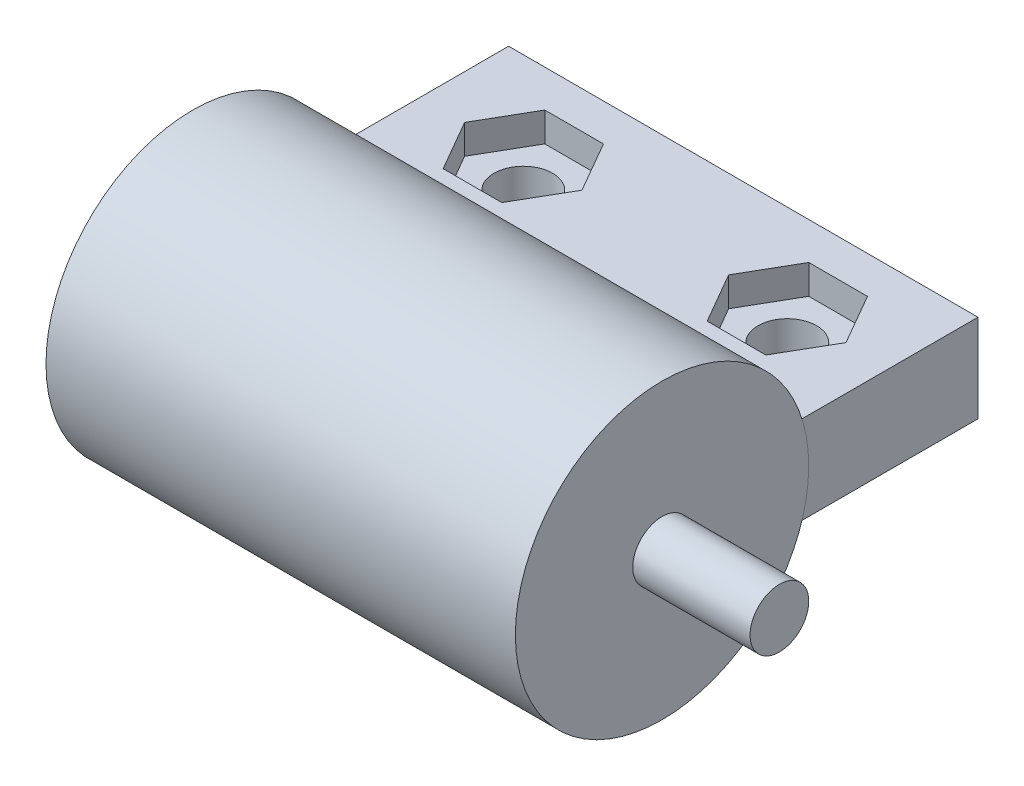
ISO-10303-21;
HEADER;
FILE_DESCRIPTION(('STEP AP214'),'2;1');
FILE_NAME('part.step','',(''),(''),'','','');
FILE_SCHEMA(('AUTOMOTIVE_DESIGN { 1 0 10303 214 1 1 1 1 }'));
ENDSEC;
DATA;
#1=APPLICATION_CONTEXT('core data for automotive mechanical design processes');
#2=APPLICATION_PROTOCOL_DEFINITION('international standard','automotive_design',2000,#1);
#3=PRODUCT_CONTEXT('',#1,'mechanical');
#4=PRODUCT('Part','Part','',(#3));
#5=PRODUCT_RELATED_PRODUCT_CATEGORY('part','',(#4));
#6=PRODUCT_DEFINITION_FORMATION('','',#4);
#7=PRODUCT_DEFINITION_CONTEXT('part definition',#1,'design');
#8=PRODUCT_DEFINITION('design','',#6,#7);
#9=PRODUCT_DEFINITION_SHAPE('','',#8);
#10=(LENGTH_UNIT() NAMED_UNIT(*) SI_UNIT(.MILLI.,.METRE.));
#11=(NAMED_UNIT(*) PLANE_ANGLE_UNIT() SI_UNIT($,.RADIAN.));
#12=(NAMED_UNIT(*) SI_UNIT($,.STERADIAN.) SOLID_ANGLE_UNIT());
#13=UNCERTAINTY_MEASURE_WITH_UNIT(LENGTH_MEASURE(1.E-05),#10,'distance_accuracy_value','');
#14=(GEOMETRIC_REPRESENTATION_CONTEXT(3) GLOBAL_UNCERTAINTY_ASSIGNED_CONTEXT((#13)) GLOBAL_UNIT_ASSIGNED_CONTEXT((#10,
#11,#12)) REPRESENTATION_CONTEXT('',''));
#15=CARTESIAN_POINT('',(0.,0.,0.));
#16=DIRECTION('',(0.,0.,1.));
#17=DIRECTION('',(1.,0.,0.));
#18=AXIS2_PLACEMENT_3D('',#15,#16,#17);
#19=CARTESIAN_POINT('',(-7.07106781186547,0.749999999999999,2.38484800354237));
#20=DIRECTION('',(1.,0.,0.));
#21=DIRECTION('',(0.,0.,-1.));
#22=AXIS2_PLACEMENT_3D('',#19,#20,#21);
#23=CYLINDRICAL_SURFACE('',#22,2.5);
#24=CARTESIAN_POINT('',(0.,0.749999999999999,2.38484800354237));
#25=DIRECTION('',(1.,0.,0.));
#26=DIRECTION('',(0.,0.,-1.));
#27=AXIS2_PLACEMENT_3D('',#24,#25,#26);
#28=CIRCLE('',#27,2.5);
#29=CARTESIAN_POINT('',(0.,0.749999999999999,-0.115151996457631));
#30=VERTEX_POINT('',#29);
#31=EDGE_CURVE('E58',#30,#30,#28,.F.);
#32=ORIENTED_EDGE('',*,*,#31,.F.);
#33=EDGE_LOOP('',(#32));
#34=FACE_BOUND('',#33,.T.);
#35=CARTESIAN_POINT('',(8.,0.749999999999999,2.38484800354237));
#36=DIRECTION('',(1.,0.,0.));
#37=DIRECTION('',(0.,0.,-1.));
#38=AXIS2_PLACEMENT_3D('',#35,#36,#37);
#39=CIRCLE('',#38,2.5);
#40=CARTESIAN_POINT('',(8.,0.749999999999999,-0.115151996457631));
#41=VERTEX_POINT('',#40);
#42=EDGE_CURVE('E68',#41,#41,#39,.T.);
#43=ORIENTED_EDGE('',*,*,#42,.F.);
#44=EDGE_LOOP('',(#43));
#45=FACE_BOUND('',#44,.T.);
#46=ADVANCED_FACE('F55',(#34,#45),#23,.T.);
#47=CARTESIAN_POINT('',(8.,0.749999999999999,2.38484800354237));
#48=DIRECTION('',(1.,0.,0.));
#49=DIRECTION('',(0.,0.,-1.));
#50=AXIS2_PLACEMENT_3D('',#47,#48,#49);
#51=PLANE('',#50);
#52=CARTESIAN_POINT('',(8.,0.749999999999999,2.38484800354236));
#53=DIRECTION('',(1.,0.,0.));
#54=DIRECTION('',(0.,0.,-1.));
#55=AXIS2_PLACEMENT_3D('',#52,#53,#54);
#56=CIRCLE('',#55,0.5);
#57=CARTESIAN_POINT('',(8.,0.749999999999999,1.88484800354236));
#58=VERTEX_POINT('',#57);
#59=EDGE_CURVE('E11',#58,#58,#56,.T.);
#60=ORIENTED_EDGE('',*,*,#59,.F.);
#61=EDGE_LOOP('',(#60));
#62=FACE_BOUND('',#61,.T.);
#63=ORIENTED_EDGE('',*,*,#42,.T.);
#64=EDGE_LOOP('',(#63));
#65=FACE_BOUND('',#64,.T.);
#66=ADVANCED_FACE('F91',(#62,#65),#51,.T.);
#67=CARTESIAN_POINT('',(0.,1.,0.));
#68=DIRECTION('',(1.,0.,0.));
#69=DIRECTION('',(0.,0.,-1.));
#70=AXIS2_PLACEMENT_3D('',#67,#68,#69);
#71=PLANE('',#70);
#72=ORIENTED_EDGE('',*,*,#31,.T.);
#73=EDGE_LOOP('',(#72));
#74=FACE_BOUND('',#73,.T.);
#75=ADVANCED_FACE('F83',(#74),#71,.F.);
#76=CARTESIAN_POINT('',(10.,0.749999999999999,2.38484800354236));
#77=DIRECTION('',(-1.,0.,0.));
#78=DIRECTION('',(0.,0.,1.));
#79=AXIS2_PLACEMENT_3D('',#76,#77,#78);
#80=CYLINDRICAL_SURFACE('',#79,0.5);
#81=CARTESIAN_POINT('',(10.,0.749999999999999,2.38484800354236));
#82=DIRECTION('',(1.,0.,0.));
#83=DIRECTION('',(0.,0.,-1.));
#84=AXIS2_PLACEMENT_3D('',#81,#82,#83);
#85=CIRCLE('',#84,0.5);
#86=CARTESIAN_POINT('',(10.,0.749999999999999,1.88484800354236));
#87=VERTEX_POINT('',#86);
#88=EDGE_CURVE('E70',#87,#87,#85,.T.);
#89=ORIENTED_EDGE('',*,*,#88,.F.);
#90=EDGE_LOOP('',(#89));
#91=FACE_BOUND('',#90,.T.);
#92=ORIENTED_EDGE('',*,*,#59,.T.);
#93=EDGE_LOOP('',(#92));
#94=FACE_BOUND('',#93,.T.);
#95=ADVANCED_FACE('F81',(#91,#94),#80,.T.);
#96=CARTESIAN_POINT('',(10.,0.749999999999999,2.38484800354236));
#97=DIRECTION('',(1.,0.,0.));
#98=DIRECTION('',(0.,0.,-1.));
#99=AXIS2_PLACEMENT_3D('',#96,#97,#98);
#100=PLANE('',#99);
#101=ORIENTED_EDGE('',*,*,#88,.T.);
#102=EDGE_LOOP('',(#101));
#103=FACE_BOUND('',#102,.T.);
#104=ADVANCED_FACE('F79',(#103),#100,.T.);
#105=CLOSED_SHELL('',(#46,#66,#75,#95,#104));
#106=MANIFOLD_SOLID_BREP('B2',#105);
#107=CARTESIAN_POINT('',(0.,1.,0.));
#108=DIRECTION('',(0.,-1.,0.));
#109=DIRECTION('',(0.,0.,-1.));
#110=AXIS2_PLACEMENT_3D('',#107,#108,#109);
#111=PLANE('',#110);
#112=CARTESIAN_POINT('',(1.75,1.,-1.5));
#113=DIRECTION('',(0.,1.,0.));
#114=DIRECTION('',(0.,0.,1.));
#115=AXIS2_PLACEMENT_3D('',#112,#113,#114);
#116=CIRCLE('',#115,0.5);
#117=CARTESIAN_POINT('',(1.75,1.,-1.));
#118=VERTEX_POINT('',#117);
#119=EDGE_CURVE('E283',#118,#118,#116,.T.);
#120=ORIENTED_EDGE('',*,*,#119,.F.);
#121=EDGE_LOOP('',(#120));
#122=FACE_BOUND('',#121,.T.);
#123=DIRECTION('',(-1.,0.,0.));
#124=VECTOR('',#123,1.);
#125=CARTESIAN_POINT('',(0.,1.,-0.63397459621556));
#126=LINE('',#125,#124);
#127=CARTESIAN_POINT('',(2.25,1.,-0.63397459621556));
#128=VERTEX_POINT('',#127);
#129=CARTESIAN_POINT('',(1.25,1.,-0.63397459621556));
#130=VERTEX_POINT('',#129);
#131=EDGE_CURVE('E145',#128,#130,#126,.T.);
#132=ORIENTED_EDGE('',*,*,#131,.F.);
#133=DIRECTION('',(0.499999999999998,0.,-0.86602540378444));
#134=VECTOR('',#133,1.);
#135=CARTESIAN_POINT('',(1.41298094716168,1.,0.815784930203602));
#136=LINE('',#135,#134);
#137=CARTESIAN_POINT('',(2.75,1.,-1.5));
#138=VERTEX_POINT('',#137);
#139=EDGE_CURVE('E150',#128,#138,#136,.T.);
#140=ORIENTED_EDGE('',*,*,#139,.T.);
#141=DIRECTION('',(0.499999999999998,0.,0.86602540378444));
#142=VECTOR('',#141,1.);
#143=CARTESIAN_POINT('',(2.71201905283833,1.,-1.5657849302036));
#144=LINE('',#143,#142);
#145=CARTESIAN_POINT('',(2.25,1.,-2.36602540378444));
#146=VERTEX_POINT('',#145);
#147=EDGE_CURVE('E360',#146,#138,#144,.T.);
#148=ORIENTED_EDGE('',*,*,#147,.F.);
#149=DIRECTION('',(-1.,0.,0.));
#150=VECTOR('',#149,1.);
#151=CARTESIAN_POINT('',(0.,1.,-2.36602540378444));
#152=LINE('',#151,#150);
#153=CARTESIAN_POINT('',(1.25,1.,-2.36602540378444));
#154=VERTEX_POINT('',#153);
#155=EDGE_CURVE('E358',#146,#154,#152,.T.);
#156=ORIENTED_EDGE('',*,*,#155,.T.);
#157=DIRECTION('',(-0.499999999999998,0.,0.86602540378444));
#158=VECTOR('',#157,1.);
#159=CARTESIAN_POINT('',(-0.0870190528383232,1.,-0.0502404735808319));
#160=LINE('',#159,#158);
#161=CARTESIAN_POINT('',(0.750000000000002,1.,-1.5));
#162=VERTEX_POINT('',#161);
#163=EDGE_CURVE('E356',#154,#162,#160,.T.);
#164=ORIENTED_EDGE('',*,*,#163,.T.);
#165=DIRECTION('',(-0.499999999999998,0.,-0.86602540378444));
#166=VECTOR('',#165,1.);
#167=CARTESIAN_POINT('',(1.21201905283833,1.,-0.699759526419161));
#168=LINE('',#167,#166);
#169=EDGE_CURVE('E354',#130,#162,#168,.T.);
#170=ORIENTED_EDGE('',*,*,#169,.F.);
#171=EDGE_LOOP('',(#132,#140,#148,#156,#164,#170));
#172=FACE_BOUND('',#171,.T.);
#173=ADVANCED_FACE('F130',(#122,#172),#111,.F.);
#174=DIRECTION('',(1.,0.,0.));
#175=VECTOR('',#174,1.);
#176=CARTESIAN_POINT('',(0.,1.,-2.36602540378444));
#177=LINE('',#176,#175);
#178=CARTESIAN_POINT('',(5.75,1.,-2.36602540378444));
#179=VERTEX_POINT('',#178);
#180=CARTESIAN_POINT('',(6.75,1.,-2.36602540378444));
#181=VERTEX_POINT('',#180);
#182=EDGE_CURVE('E366',#179,#181,#177,.T.);
#183=ORIENTED_EDGE('',*,*,#182,.F.);
#184=DIRECTION('',(-0.499999999999997,0.,0.86602540378444));
#185=VECTOR('',#184,1.);
#186=CARTESIAN_POINT('',(3.28798094716169,1.,1.89831668493415));
#187=LINE('',#186,#185);
#188=CARTESIAN_POINT('',(5.25,1.,-1.5));
#189=VERTEX_POINT('',#188);
#190=EDGE_CURVE('E364',#179,#189,#187,.T.);
#191=ORIENTED_EDGE('',*,*,#190,.T.);
#192=DIRECTION('',(-0.499999999999997,0.,-0.86602540378444));
#193=VECTOR('',#192,1.);
#194=CARTESIAN_POINT('',(4.58701905283834,1.,-2.64831668493414));
#195=LINE('',#194,#193);
#196=CARTESIAN_POINT('',(5.75,1.,-0.633974596215561));
#197=VERTEX_POINT('',#196);
#198=EDGE_CURVE('E263',#197,#189,#195,.T.);
#199=ORIENTED_EDGE('',*,*,#198,.F.);
#200=DIRECTION('',(1.,0.,0.));
#201=VECTOR('',#200,1.);
#202=CARTESIAN_POINT('',(0.,1.,-0.63397459621556));
#203=LINE('',#202,#201);
#204=CARTESIAN_POINT('',(6.75,1.,-0.633974596215561));
#205=VERTEX_POINT('',#204);
#206=EDGE_CURVE('E374',#197,#205,#203,.T.);
#207=ORIENTED_EDGE('',*,*,#206,.T.);
#208=DIRECTION('',(0.499999999999997,0.,-0.86602540378444));
#209=VECTOR('',#208,1.);
#210=CARTESIAN_POINT('',(4.78798094716169,1.,2.76434208871858));
#211=LINE('',#210,#209);
#212=CARTESIAN_POINT('',(7.25,1.,-1.5));
#213=VERTEX_POINT('',#212);
#214=EDGE_CURVE('E372',#205,#213,#211,.T.);
#215=ORIENTED_EDGE('',*,*,#214,.T.);
#216=DIRECTION('',(0.499999999999998,0.,0.86602540378444));
#217=VECTOR('',#216,1.);
#218=CARTESIAN_POINT('',(6.08701905283834,1.,-3.51434208871858));
#219=LINE('',#218,#217);
#220=EDGE_CURVE('E369',#181,#213,#219,.T.);
#221=ORIENTED_EDGE('',*,*,#220,.F.);
#222=EDGE_LOOP('',(#183,#191,#199,#207,#215,#221));
#223=FACE_BOUND('',#222,.T.);
#224=CARTESIAN_POINT('',(6.25,1.,-1.5));
#225=DIRECTION('',(0.,1.,0.));
#226=DIRECTION('',(0.,0.,1.));
#227=AXIS2_PLACEMENT_3D('',#224,#225,#226);
#228=CIRCLE('',#227,0.500000000000001);
#229=CARTESIAN_POINT('',(6.25,1.,-0.999999999999999));
#230=VERTEX_POINT('',#229);
#231=EDGE_CURVE('E275',#230,#230,#228,.T.);
#232=ORIENTED_EDGE('',*,*,#231,.F.);
#233=EDGE_LOOP('',(#232));
#234=FACE_BOUND('',#233,.T.);
#235=ADVANCED_FACE('F426',(#223,#234),#111,.F.);
#236=CARTESIAN_POINT('',(0.,0.,0.));
#237=DIRECTION('',(0.,-1.,0.));
#238=DIRECTION('',(0.,0.,-1.));
#239=AXIS2_PLACEMENT_3D('',#236,#237,#238);
#240=PLANE('',#239);
#241=CARTESIAN_POINT('',(1.75,0.,-1.5));
#242=DIRECTION('',(0.,1.,0.));
#243=DIRECTION('',(0.,0.,1.));
#244=AXIS2_PLACEMENT_3D('',#241,#242,#243);
#245=CIRCLE('',#244,0.5);
#246=CARTESIAN_POINT('',(1.75,0.,-1.));
#247=VERTEX_POINT('',#246);
#248=EDGE_CURVE('E278',#247,#247,#245,.T.);
#249=ORIENTED_EDGE('',*,*,#248,.T.);
#250=EDGE_LOOP('',(#249));
#251=FACE_BOUND('',#250,.T.);
#252=DIRECTION('',(0.,0.,1.));
#253=VECTOR('',#252,1.);
#254=CARTESIAN_POINT('',(0.,0.,0.));
#255=LINE('',#254,#253);
#256=CARTESIAN_POINT('',(0.,0.,-3.));
#257=VERTEX_POINT('',#256);
#258=CARTESIAN_POINT('',(0.,0.,0.));
#259=VERTEX_POINT('',#258);
#260=EDGE_CURVE('E286',#257,#259,#255,.T.);
#261=ORIENTED_EDGE('',*,*,#260,.F.);
#262=DIRECTION('',(-1.,0.,0.));
#263=VECTOR('',#262,1.);
#264=CARTESIAN_POINT('',(0.,0.,-3.));
#265=LINE('',#264,#263);
#266=CARTESIAN_POINT('',(8.,0.,-3.));
#267=VERTEX_POINT('',#266);
#268=EDGE_CURVE('E295',#267,#257,#265,.T.);
#269=ORIENTED_EDGE('',*,*,#268,.F.);
#270=DIRECTION('',(0.,0.,-1.));
#271=VECTOR('',#270,1.);
#272=CARTESIAN_POINT('',(8.,0.,0.));
#273=LINE('',#272,#271);
#274=CARTESIAN_POINT('',(8.,0.,0.));
#275=VERTEX_POINT('',#274);
#276=EDGE_CURVE('E293',#275,#267,#273,.T.);
#277=ORIENTED_EDGE('',*,*,#276,.F.);
#278=DIRECTION('',(1.,0.,0.));
#279=VECTOR('',#278,1.);
#280=CARTESIAN_POINT('',(0.,0.,0.));
#281=LINE('',#280,#279);
#282=EDGE_CURVE('E291',#259,#275,#281,.T.);
#283=ORIENTED_EDGE('',*,*,#282,.F.);
#284=EDGE_LOOP('',(#261,#269,#277,#283));
#285=FACE_BOUND('',#284,.T.);
#286=CARTESIAN_POINT('',(6.25,0.,-1.5));
#287=DIRECTION('',(0.,1.,0.));
#288=DIRECTION('',(0.,0.,1.));
#289=AXIS2_PLACEMENT_3D('',#286,#287,#288);
#290=CIRCLE('',#289,0.500000000000001);
#291=CARTESIAN_POINT('',(6.25,0.,-0.999999999999999));
#292=VERTEX_POINT('',#291);
#293=EDGE_CURVE('E279',#292,#292,#290,.T.);
#294=ORIENTED_EDGE('',*,*,#293,.T.);
#295=EDGE_LOOP('',(#294));
#296=FACE_BOUND('',#295,.T.);
#297=ADVANCED_FACE('F315',(#251,#285,#296),#240,.T.);
#298=CARTESIAN_POINT('',(0.,1.,0.));
#299=DIRECTION('',(1.,0.,0.));
#300=DIRECTION('',(0.,0.,-1.));
#301=AXIS2_PLACEMENT_3D('',#298,#299,#300);
#302=PLANE('',#301);
#303=ORIENTED_EDGE('',*,*,#260,.T.);
#304=DIRECTION('',(0.,-1.,0.));
#305=VECTOR('',#304,1.);
#306=CARTESIAN_POINT('',(0.,1.,0.));
#307=LINE('',#306,#305);
#308=CARTESIAN_POINT('',(0.,1.5,0.));
#309=VERTEX_POINT('',#308);
#310=EDGE_CURVE('E53',#309,#259,#307,.T.);
#311=ORIENTED_EDGE('',*,*,#310,.F.);
#312=DIRECTION('',(0.,0.,1.));
#313=VECTOR('',#312,1.);
#314=CARTESIAN_POINT('',(0.,1.5,0.));
#315=LINE('',#314,#313);
#316=CARTESIAN_POINT('',(0.,1.5,-3.));
#317=VERTEX_POINT('',#316);
#318=EDGE_CURVE('E323',#317,#309,#315,.T.);
#319=ORIENTED_EDGE('',*,*,#318,.F.);
#320=DIRECTION('',(0.,-1.,0.));
#321=VECTOR('',#320,1.);
#322=CARTESIAN_POINT('',(0.,1.,-3.));
#323=LINE('',#322,#321);
#324=EDGE_CURVE('E297',#317,#257,#323,.T.);
#325=ORIENTED_EDGE('',*,*,#324,.T.);
#326=EDGE_LOOP('',(#303,#311,#319,#325));
#327=FACE_BOUND('',#326,.T.);
#328=ADVANCED_FACE('F132',(#327),#302,.F.);
#329=CARTESIAN_POINT('',(0.,1.,0.));
#330=DIRECTION('',(0.,0.,-1.));
#331=DIRECTION('',(-1.,0.,0.));
#332=AXIS2_PLACEMENT_3D('',#329,#330,#331);
#333=PLANE('',#332);
#334=ORIENTED_EDGE('',*,*,#282,.T.);
#335=DIRECTION('',(0.,-1.,0.));
#336=VECTOR('',#335,1.);
#337=CARTESIAN_POINT('',(8.,1.,0.));
#338=LINE('',#337,#336);
#339=CARTESIAN_POINT('',(8.,1.5,0.));
#340=VERTEX_POINT('',#339);
#341=EDGE_CURVE('E138',#340,#275,#338,.T.);
#342=ORIENTED_EDGE('',*,*,#341,.F.);
#343=DIRECTION('',(1.,0.,0.));
#344=VECTOR('',#343,1.);
#345=CARTESIAN_POINT('',(0.,1.5,0.));
#346=LINE('',#345,#344);
#347=EDGE_CURVE('E325',#309,#340,#346,.T.);
#348=ORIENTED_EDGE('',*,*,#347,.F.);
#349=ORIENTED_EDGE('',*,*,#310,.T.);
#350=EDGE_LOOP('',(#334,#342,#348,#349));
#351=FACE_BOUND('',#350,.T.);
#352=ADVANCED_FACE('F445',(#351),#333,.F.);
#353=CARTESIAN_POINT('',(8.,1.,0.));
#354=DIRECTION('',(-1.,0.,0.));
#355=DIRECTION('',(0.,0.,1.));
#356=AXIS2_PLACEMENT_3D('',#353,#354,#355);
#357=PLANE('',#356);
#358=ORIENTED_EDGE('',*,*,#276,.T.);
#359=DIRECTION('',(0.,-1.,0.));
#360=VECTOR('',#359,1.);
#361=CARTESIAN_POINT('',(8.,1.,-3.));
#362=LINE('',#361,#360);
#363=CARTESIAN_POINT('',(8.,1.5,-3.));
#364=VERTEX_POINT('',#363);
#365=EDGE_CURVE('E300',#364,#267,#362,.T.);
#366=ORIENTED_EDGE('',*,*,#365,.F.);
#367=DIRECTION('',(0.,0.,-1.));
#368=VECTOR('',#367,1.);
#369=CARTESIAN_POINT('',(8.,1.5,0.));
#370=LINE('',#369,#368);
#371=EDGE_CURVE('E308',#340,#364,#370,.T.);
#372=ORIENTED_EDGE('',*,*,#371,.F.);
#373=ORIENTED_EDGE('',*,*,#341,.T.);
#374=EDGE_LOOP('',(#358,#366,#372,#373));
#375=FACE_BOUND('',#374,.T.);
#376=ADVANCED_FACE('F306',(#375),#357,.F.);
#377=CARTESIAN_POINT('',(0.,1.,-3.));
#378=DIRECTION('',(0.,0.,1.));
#379=DIRECTION('',(1.,0.,0.));
#380=AXIS2_PLACEMENT_3D('',#377,#378,#379);
#381=PLANE('',#380);
#382=ORIENTED_EDGE('',*,*,#268,.T.);
#383=ORIENTED_EDGE('',*,*,#324,.F.);
#384=DIRECTION('',(-1.,0.,0.));
#385=VECTOR('',#384,1.);
#386=CARTESIAN_POINT('',(0.,1.5,-3.));
#387=LINE('',#386,#385);
#388=EDGE_CURVE('E326',#364,#317,#387,.T.);
#389=ORIENTED_EDGE('',*,*,#388,.F.);
#390=ORIENTED_EDGE('',*,*,#365,.T.);
#391=EDGE_LOOP('',(#382,#383,#389,#390));
#392=FACE_BOUND('',#391,.T.);
#393=ADVANCED_FACE('F318',(#392),#381,.F.);
#394=CARTESIAN_POINT('',(1.75,1.,-1.5));
#395=DIRECTION('',(0.,-1.,0.));
#396=DIRECTION('',(0.,0.,-1.));
#397=AXIS2_PLACEMENT_3D('',#394,#395,#396);
#398=CYLINDRICAL_SURFACE('',#397,0.5);
#399=ORIENTED_EDGE('',*,*,#119,.T.);
#400=EDGE_LOOP('',(#399));
#401=FACE_BOUND('',#400,.T.);
#402=ORIENTED_EDGE('',*,*,#248,.F.);
#403=EDGE_LOOP('',(#402));
#404=FACE_BOUND('',#403,.T.);
#405=ADVANCED_FACE('F437',(#401,#404),#398,.F.);
#406=CARTESIAN_POINT('',(6.25,1.,-1.5));
#407=DIRECTION('',(0.,-1.,0.));
#408=DIRECTION('',(0.,0.,-1.));
#409=AXIS2_PLACEMENT_3D('',#406,#407,#408);
#410=CYLINDRICAL_SURFACE('',#409,0.500000000000001);
#411=ORIENTED_EDGE('',*,*,#231,.T.);
#412=EDGE_LOOP('',(#411));
#413=FACE_BOUND('',#412,.T.);
#414=ORIENTED_EDGE('',*,*,#293,.F.);
#415=EDGE_LOOP('',(#414));
#416=FACE_BOUND('',#415,.T.);
#417=ADVANCED_FACE('F501',(#413,#416),#410,.F.);
#418=CARTESIAN_POINT('',(3.28798094716169,1.5,1.89831668493415));
#419=DIRECTION('',(0.86602540378444,0.,0.499999999999997));
#420=DIRECTION('',(0.499999999999997,0.,-0.86602540378444));
#421=AXIS2_PLACEMENT_3D('',#418,#419,#420);
#422=PLANE('',#421);
#423=ORIENTED_EDGE('',*,*,#190,.F.);
#424=DIRECTION('',(0.,-1.,0.));
#425=VECTOR('',#424,1.);
#426=CARTESIAN_POINT('',(5.75,1.5,-2.36602540378444));
#427=LINE('',#426,#425);
#428=CARTESIAN_POINT('',(5.75,1.5,-2.36602540378444));
#429=VERTEX_POINT('',#428);
#430=EDGE_CURVE('E282',#429,#179,#427,.T.);
#431=ORIENTED_EDGE('',*,*,#430,.F.);
#432=DIRECTION('',(-0.499999999999997,0.,0.86602540378444));
#433=VECTOR('',#432,1.);
#434=CARTESIAN_POINT('',(3.28798094716169,1.5,1.89831668493415));
#435=LINE('',#434,#433);
#436=CARTESIAN_POINT('',(5.25,1.5,-1.5));
#437=VERTEX_POINT('',#436);
#438=EDGE_CURVE('E336',#429,#437,#435,.T.);
#439=ORIENTED_EDGE('',*,*,#438,.T.);
#440=DIRECTION('',(0.,-1.,0.));
#441=VECTOR('',#440,1.);
#442=CARTESIAN_POINT('',(5.25,1.5,-1.5));
#443=LINE('',#442,#441);
#444=EDGE_CURVE('E266',#437,#189,#443,.T.);
#445=ORIENTED_EDGE('',*,*,#444,.T.);
#446=EDGE_LOOP('',(#423,#431,#439,#445));
#447=FACE_BOUND('',#446,.T.);
#448=ADVANCED_FACE('F508',(#447),#422,.T.);
#449=CARTESIAN_POINT('',(0.,1.5,-2.36602540378444));
#450=DIRECTION('',(0.,0.,-1.));
#451=DIRECTION('',(-1.,0.,0.));
#452=AXIS2_PLACEMENT_3D('',#449,#450,#451);
#453=PLANE('',#452);
#454=ORIENTED_EDGE('',*,*,#182,.T.);
#455=DIRECTION('',(0.,-1.,0.));
#456=VECTOR('',#455,1.);
#457=CARTESIAN_POINT('',(6.75,1.5,-2.36602540378444));
#458=LINE('',#457,#456);
#459=CARTESIAN_POINT('',(6.75,1.5,-2.36602540378444));
#460=VERTEX_POINT('',#459);
#461=EDGE_CURVE('E386',#460,#181,#458,.T.);
#462=ORIENTED_EDGE('',*,*,#461,.F.);
#463=DIRECTION('',(1.,0.,0.));
#464=VECTOR('',#463,1.);
#465=CARTESIAN_POINT('',(0.,1.5,-2.36602540378444));
#466=LINE('',#465,#464);
#467=EDGE_CURVE('E339',#429,#460,#466,.T.);
#468=ORIENTED_EDGE('',*,*,#467,.F.);
#469=ORIENTED_EDGE('',*,*,#430,.T.);
#470=EDGE_LOOP('',(#454,#462,#468,#469));
#471=FACE_BOUND('',#470,.T.);
#472=ADVANCED_FACE('F521',(#471),#453,.F.);
#473=CARTESIAN_POINT('',(6.08701905283834,1.5,-3.51434208871858));
#474=DIRECTION('',(0.86602540378444,0.,-0.499999999999998));
#475=DIRECTION('',(-0.499999999999998,0.,-0.86602540378444));
#476=AXIS2_PLACEMENT_3D('',#473,#474,#475);
#477=PLANE('',#476);
#478=ORIENTED_EDGE('',*,*,#220,.T.);
#479=DIRECTION('',(0.,-1.,0.));
#480=VECTOR('',#479,1.);
#481=CARTESIAN_POINT('',(7.25,1.5,-1.5));
#482=LINE('',#481,#480);
#483=CARTESIAN_POINT('',(7.25,1.5,-1.5));
#484=VERTEX_POINT('',#483);
#485=EDGE_CURVE('E383',#484,#213,#482,.T.);
#486=ORIENTED_EDGE('',*,*,#485,.F.);
#487=DIRECTION('',(0.499999999999998,0.,0.86602540378444));
#488=VECTOR('',#487,1.);
#489=CARTESIAN_POINT('',(6.08701905283834,1.5,-3.51434208871858));
#490=LINE('',#489,#488);
#491=EDGE_CURVE('E342',#460,#484,#490,.T.);
#492=ORIENTED_EDGE('',*,*,#491,.F.);
#493=ORIENTED_EDGE('',*,*,#461,.T.);
#494=EDGE_LOOP('',(#478,#486,#492,#493));
#495=FACE_BOUND('',#494,.T.);
#496=ADVANCED_FACE('F529',(#495),#477,.F.);
#497=CARTESIAN_POINT('',(4.78798094716169,1.5,2.76434208871858));
#498=DIRECTION('',(-0.86602540378444,0.,-0.499999999999997));
#499=DIRECTION('',(-0.499999999999997,0.,0.86602540378444));
#500=AXIS2_PLACEMENT_3D('',#497,#498,#499);
#501=PLANE('',#500);
#502=ORIENTED_EDGE('',*,*,#214,.F.);
#503=DIRECTION('',(0.,-1.,0.));
#504=VECTOR('',#503,1.);
#505=CARTESIAN_POINT('',(6.75,1.5,-0.633974596215561));
#506=LINE('',#505,#504);
#507=CARTESIAN_POINT('',(6.75,1.5,-0.633974596215561));
#508=VERTEX_POINT('',#507);
#509=EDGE_CURVE('E380',#508,#205,#506,.T.);
#510=ORIENTED_EDGE('',*,*,#509,.F.);
#511=DIRECTION('',(0.499999999999997,0.,-0.86602540378444));
#512=VECTOR('',#511,1.);
#513=CARTESIAN_POINT('',(4.78798094716169,1.5,2.76434208871858));
#514=LINE('',#513,#512);
#515=EDGE_CURVE('E344',#508,#484,#514,.T.);
#516=ORIENTED_EDGE('',*,*,#515,.T.);
#517=ORIENTED_EDGE('',*,*,#485,.T.);
#518=EDGE_LOOP('',(#502,#510,#516,#517));
#519=FACE_BOUND('',#518,.T.);
#520=ADVANCED_FACE('F538',(#519),#501,.T.);
#521=CARTESIAN_POINT('',(0.,1.5,-0.63397459621556));
#522=DIRECTION('',(0.,0.,-1.));
#523=DIRECTION('',(-1.,0.,0.));
#524=AXIS2_PLACEMENT_3D('',#521,#522,#523);
#525=PLANE('',#524);
#526=ORIENTED_EDGE('',*,*,#206,.F.);
#527=DIRECTION('',(0.,-1.,0.));
#528=VECTOR('',#527,1.);
#529=CARTESIAN_POINT('',(5.75,1.5,-0.633974596215561));
#530=LINE('',#529,#528);
#531=CARTESIAN_POINT('',(5.75,1.5,-0.633974596215561));
#532=VERTEX_POINT('',#531);
#533=EDGE_CURVE('E269',#532,#197,#530,.T.);
#534=ORIENTED_EDGE('',*,*,#533,.F.);
#535=DIRECTION('',(1.,0.,0.));
#536=VECTOR('',#535,1.);
#537=CARTESIAN_POINT('',(0.,1.5,-0.63397459621556));
#538=LINE('',#537,#536);
#539=EDGE_CURVE('E347',#532,#508,#538,.T.);
#540=ORIENTED_EDGE('',*,*,#539,.T.);
#541=ORIENTED_EDGE('',*,*,#509,.T.);
#542=EDGE_LOOP('',(#526,#534,#540,#541));
#543=FACE_BOUND('',#542,.T.);
#544=ADVANCED_FACE('F547',(#543),#525,.T.);
#545=CARTESIAN_POINT('',(0.,1.5,-0.63397459621556));
#546=DIRECTION('',(0.,0.,1.));
#547=DIRECTION('',(1.,0.,0.));
#548=AXIS2_PLACEMENT_3D('',#545,#546,#547);
#549=PLANE('',#548);
#550=ORIENTED_EDGE('',*,*,#131,.T.);
#551=DIRECTION('',(0.,-1.,0.));
#552=VECTOR('',#551,1.);
#553=CARTESIAN_POINT('',(1.25,1.5,-0.63397459621556));
#554=LINE('',#553,#552);
#555=CARTESIAN_POINT('',(1.25,1.5,-0.63397459621556));
#556=VERTEX_POINT('',#555);
#557=EDGE_CURVE('E247',#556,#130,#554,.T.);
#558=ORIENTED_EDGE('',*,*,#557,.F.);
#559=DIRECTION('',(-1.,0.,0.));
#560=VECTOR('',#559,1.);
#561=CARTESIAN_POINT('',(0.,1.5,-0.63397459621556));
#562=LINE('',#561,#560);
#563=CARTESIAN_POINT('',(2.25,1.5,-0.63397459621556));
#564=VERTEX_POINT('',#563);
#565=EDGE_CURVE('E254',#564,#556,#562,.T.);
#566=ORIENTED_EDGE('',*,*,#565,.F.);
#567=DIRECTION('',(0.,-1.,0.));
#568=VECTOR('',#567,1.);
#569=CARTESIAN_POINT('',(2.25,1.5,-0.63397459621556));
#570=LINE('',#569,#568);
#571=EDGE_CURVE('E352',#564,#128,#570,.T.);
#572=ORIENTED_EDGE('',*,*,#571,.T.);
#573=EDGE_LOOP('',(#550,#558,#566,#572));
#574=FACE_BOUND('',#573,.T.);
#575=ADVANCED_FACE('F265',(#574),#549,.F.);
#576=CARTESIAN_POINT('',(1.21201905283833,1.5,-0.699759526419161));
#577=DIRECTION('',(-0.86602540378444,0.,0.499999999999998));
#578=DIRECTION('',(0.499999999999998,0.,0.86602540378444));
#579=AXIS2_PLACEMENT_3D('',#576,#577,#578);
#580=PLANE('',#579);
#581=ORIENTED_EDGE('',*,*,#169,.T.);
#582=DIRECTION('',(0.,-1.,0.));
#583=VECTOR('',#582,1.);
#584=CARTESIAN_POINT('',(0.750000000000002,1.5,-1.5));
#585=LINE('',#584,#583);
#586=CARTESIAN_POINT('',(0.750000000000002,1.5,-1.5));
#587=VERTEX_POINT('',#586);
#588=EDGE_CURVE('E249',#587,#162,#585,.T.);
#589=ORIENTED_EDGE('',*,*,#588,.F.);
#590=DIRECTION('',(-0.499999999999998,0.,-0.86602540378444));
#591=VECTOR('',#590,1.);
#592=CARTESIAN_POINT('',(1.21201905283833,1.5,-0.699759526419161));
#593=LINE('',#592,#591);
#594=EDGE_CURVE('E242',#556,#587,#593,.T.);
#595=ORIENTED_EDGE('',*,*,#594,.F.);
#596=ORIENTED_EDGE('',*,*,#557,.T.);
#597=EDGE_LOOP('',(#581,#589,#595,#596));
#598=FACE_BOUND('',#597,.T.);
#599=ADVANCED_FACE('F245',(#598),#580,.F.);
#600=CARTESIAN_POINT('',(-0.0870190528383232,1.5,-0.0502404735808319));
#601=DIRECTION('',(0.86602540378444,0.,0.499999999999998));
#602=DIRECTION('',(0.499999999999998,0.,-0.86602540378444));
#603=AXIS2_PLACEMENT_3D('',#600,#601,#602);
#604=PLANE('',#603);
#605=ORIENTED_EDGE('',*,*,#163,.F.);
#606=DIRECTION('',(0.,-1.,0.));
#607=VECTOR('',#606,1.);
#608=CARTESIAN_POINT('',(1.25,1.5,-2.36602540378444));
#609=LINE('',#608,#607);
#610=CARTESIAN_POINT('',(1.25,1.5,-2.36602540378444));
#611=VERTEX_POINT('',#610);
#612=EDGE_CURVE('E271',#611,#154,#609,.T.);
#613=ORIENTED_EDGE('',*,*,#612,.F.);
#614=DIRECTION('',(-0.499999999999998,0.,0.86602540378444));
#615=VECTOR('',#614,1.);
#616=CARTESIAN_POINT('',(-0.0870190528383232,1.5,-0.0502404735808319));
#617=LINE('',#616,#615);
#618=EDGE_CURVE('E253',#611,#587,#617,.T.);
#619=ORIENTED_EDGE('',*,*,#618,.T.);
#620=ORIENTED_EDGE('',*,*,#588,.T.);
#621=EDGE_LOOP('',(#605,#613,#619,#620));
#622=FACE_BOUND('',#621,.T.);
#623=ADVANCED_FACE('F405',(#622),#604,.T.);
#624=CARTESIAN_POINT('',(0.,1.5,-2.36602540378444));
#625=DIRECTION('',(0.,0.,1.));
#626=DIRECTION('',(1.,0.,0.));
#627=AXIS2_PLACEMENT_3D('',#624,#625,#626);
#628=PLANE('',#627);
#629=ORIENTED_EDGE('',*,*,#155,.F.);
#630=DIRECTION('',(0.,-1.,0.));
#631=VECTOR('',#630,1.);
#632=CARTESIAN_POINT('',(2.25,1.5,-2.36602540378444));
#633=LINE('',#632,#631);
#634=CARTESIAN_POINT('',(2.25,1.5,-2.36602540378444));
#635=VERTEX_POINT('',#634);
#636=EDGE_CURVE('E394',#635,#146,#633,.T.);
#637=ORIENTED_EDGE('',*,*,#636,.F.);
#638=DIRECTION('',(-1.,0.,0.));
#639=VECTOR('',#638,1.);
#640=CARTESIAN_POINT('',(0.,1.5,-2.36602540378444));
#641=LINE('',#640,#639);
#642=EDGE_CURVE('E403',#635,#611,#641,.T.);
#643=ORIENTED_EDGE('',*,*,#642,.T.);
#644=ORIENTED_EDGE('',*,*,#612,.T.);
#645=EDGE_LOOP('',(#629,#637,#643,#644));
#646=FACE_BOUND('',#645,.T.);
#647=ADVANCED_FACE('F401',(#646),#628,.T.);
#648=CARTESIAN_POINT('',(2.71201905283833,1.5,-1.5657849302036));
#649=DIRECTION('',(0.86602540378444,0.,-0.499999999999998));
#650=DIRECTION('',(-0.499999999999998,0.,-0.86602540378444));
#651=AXIS2_PLACEMENT_3D('',#648,#649,#650);
#652=PLANE('',#651);
#653=ORIENTED_EDGE('',*,*,#147,.T.);
#654=DIRECTION('',(0.,-1.,0.));
#655=VECTOR('',#654,1.);
#656=CARTESIAN_POINT('',(2.75,1.5,-1.5));
#657=LINE('',#656,#655);
#658=CARTESIAN_POINT('',(2.75,1.5,-1.5));
#659=VERTEX_POINT('',#658);
#660=EDGE_CURVE('E392',#659,#138,#657,.T.);
#661=ORIENTED_EDGE('',*,*,#660,.F.);
#662=DIRECTION('',(0.499999999999998,0.,0.86602540378444));
#663=VECTOR('',#662,1.);
#664=CARTESIAN_POINT('',(2.71201905283833,1.5,-1.5657849302036));
#665=LINE('',#664,#663);
#666=EDGE_CURVE('E330',#635,#659,#665,.T.);
#667=ORIENTED_EDGE('',*,*,#666,.F.);
#668=ORIENTED_EDGE('',*,*,#636,.T.);
#669=EDGE_LOOP('',(#653,#661,#667,#668));
#670=FACE_BOUND('',#669,.T.);
#671=ADVANCED_FACE('F409',(#670),#652,.F.);
#672=CARTESIAN_POINT('',(1.41298094716168,1.5,0.815784930203602));
#673=DIRECTION('',(-0.86602540378444,0.,-0.499999999999998));
#674=DIRECTION('',(-0.499999999999998,0.,0.86602540378444));
#675=AXIS2_PLACEMENT_3D('',#672,#673,#674);
#676=PLANE('',#675);
#677=ORIENTED_EDGE('',*,*,#139,.F.);
#678=ORIENTED_EDGE('',*,*,#571,.F.);
#679=DIRECTION('',(0.499999999999998,0.,-0.86602540378444));
#680=VECTOR('',#679,1.);
#681=CARTESIAN_POINT('',(1.41298094716168,1.5,0.815784930203602));
#682=LINE('',#681,#680);
#683=EDGE_CURVE('E261',#564,#659,#682,.T.);
#684=ORIENTED_EDGE('',*,*,#683,.T.);
#685=ORIENTED_EDGE('',*,*,#660,.T.);
#686=EDGE_LOOP('',(#677,#678,#684,#685));
#687=FACE_BOUND('',#686,.T.);
#688=ADVANCED_FACE('F413',(#687),#676,.T.);
#689=CARTESIAN_POINT('',(4.58701905283834,1.5,-2.64831668493414));
#690=DIRECTION('',(-0.86602540378444,0.,0.499999999999997));
#691=DIRECTION('',(0.499999999999997,0.,0.86602540378444));
#692=AXIS2_PLACEMENT_3D('',#689,#690,#691);
#693=PLANE('',#692);
#694=ORIENTED_EDGE('',*,*,#198,.T.);
#695=ORIENTED_EDGE('',*,*,#444,.F.);
#696=DIRECTION('',(-0.499999999999997,0.,-0.86602540378444));
#697=VECTOR('',#696,1.);
#698=CARTESIAN_POINT('',(4.58701905283834,1.5,-2.64831668493414));
#699=LINE('',#698,#697);
#700=EDGE_CURVE('E350',#532,#437,#699,.T.);
#701=ORIENTED_EDGE('',*,*,#700,.F.);
#702=ORIENTED_EDGE('',*,*,#533,.T.);
#703=EDGE_LOOP('',(#694,#695,#701,#702));
#704=FACE_BOUND('',#703,.T.);
#705=ADVANCED_FACE('F415',(#704),#693,.F.);
#706=CARTESIAN_POINT('',(0.,1.5,0.));
#707=DIRECTION('',(0.,1.,0.));
#708=DIRECTION('',(0.,0.,1.));
#709=AXIS2_PLACEMENT_3D('',#706,#707,#708);
#710=PLANE('',#709);
#711=ORIENTED_EDGE('',*,*,#565,.T.);
#712=ORIENTED_EDGE('',*,*,#594,.T.);
#713=ORIENTED_EDGE('',*,*,#618,.F.);
#714=ORIENTED_EDGE('',*,*,#642,.F.);
#715=ORIENTED_EDGE('',*,*,#666,.T.);
#716=ORIENTED_EDGE('',*,*,#683,.F.);
#717=EDGE_LOOP('',(#711,#712,#713,#714,#715,#716));
#718=FACE_BOUND('',#717,.T.);
#719=ORIENTED_EDGE('',*,*,#388,.T.);
#720=ORIENTED_EDGE('',*,*,#318,.T.);
#721=ORIENTED_EDGE('',*,*,#347,.T.);
#722=ORIENTED_EDGE('',*,*,#371,.T.);
#723=EDGE_LOOP('',(#719,#720,#721,#722));
#724=FACE_BOUND('',#723,.T.);
#725=ORIENTED_EDGE('',*,*,#438,.F.);
#726=ORIENTED_EDGE('',*,*,#467,.T.);
#727=ORIENTED_EDGE('',*,*,#491,.T.);
#728=ORIENTED_EDGE('',*,*,#515,.F.);
#729=ORIENTED_EDGE('',*,*,#539,.F.);
#730=ORIENTED_EDGE('',*,*,#700,.T.);
#731=EDGE_LOOP('',(#725,#726,#727,#728,#729,#730));
#732=FACE_BOUND('',#731,.T.);
#733=ADVANCED_FACE('F258',(#718,#724,#732),#710,.T.);
#734=CLOSED_SHELL('',(#173,#235,#297,#328,#352,#376,#393,#405,#417,#448,#472,#496,#520,#544,
#575,#599,#623,#647,#671,#688,#705,#733));
#735=MANIFOLD_SOLID_BREP('B6',#734);
#736=ADVANCED_BREP_SHAPE_REPRESENTATION('',(#18,#106,#735),#14);
#737=SHAPE_DEFINITION_REPRESENTATION(#9,#736);
ENDSEC;
END-ISO-10303-21;
